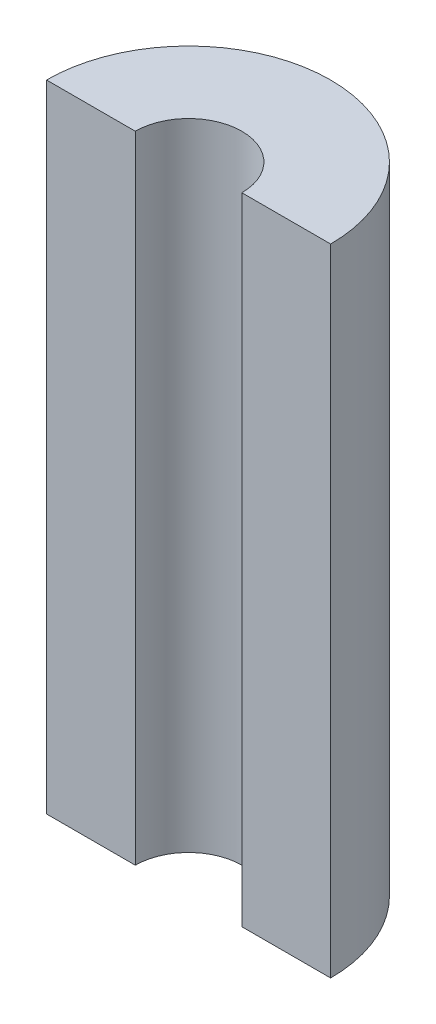
ISO-10303-21;
HEADER;
FILE_DESCRIPTION(('STEP AP214'),'2;1');
FILE_NAME('part.step','',(''),(''),'','','');
FILE_SCHEMA(('AUTOMOTIVE_DESIGN { 1 0 10303 214 1 1 1 1 }'));
ENDSEC;
DATA;
#1=APPLICATION_CONTEXT('core data for automotive mechanical design processes');
#2=APPLICATION_PROTOCOL_DEFINITION('international standard','automotive_design',2000,#1);
#3=PRODUCT_CONTEXT('',#1,'mechanical');
#4=PRODUCT('Part','Part','',(#3));
#5=PRODUCT_RELATED_PRODUCT_CATEGORY('part','',(#4));
#6=PRODUCT_DEFINITION_FORMATION('','',#4);
#7=PRODUCT_DEFINITION_CONTEXT('part definition',#1,'design');
#8=PRODUCT_DEFINITION('design','',#6,#7);
#9=PRODUCT_DEFINITION_SHAPE('','',#8);
#10=(LENGTH_UNIT() NAMED_UNIT(*) SI_UNIT(.MILLI.,.METRE.));
#11=(NAMED_UNIT(*) PLANE_ANGLE_UNIT() SI_UNIT($,.RADIAN.));
#12=(NAMED_UNIT(*) SI_UNIT($,.STERADIAN.) SOLID_ANGLE_UNIT());
#13=UNCERTAINTY_MEASURE_WITH_UNIT(LENGTH_MEASURE(1.E-05),#10,'distance_accuracy_value','');
#14=(GEOMETRIC_REPRESENTATION_CONTEXT(3) GLOBAL_UNCERTAINTY_ASSIGNED_CONTEXT((#13)) GLOBAL_UNIT_ASSIGNED_CONTEXT((#10,
#11,#12)) REPRESENTATION_CONTEXT('',''));
#15=CARTESIAN_POINT('',(0.,0.,0.));
#16=DIRECTION('',(0.,0.,1.));
#17=DIRECTION('',(1.,0.,0.));
#18=AXIS2_PLACEMENT_3D('',#15,#16,#17);
#19=CARTESIAN_POINT('',(0.,0.,0.));
#20=DIRECTION('',(0.,0.,1.));
#21=DIRECTION('',(1.,0.,0.));
#22=AXIS2_PLACEMENT_3D('',#19,#20,#21);
#23=PLANE('',#22);
#24=DIRECTION('',(1.,0.,0.));
#25=VECTOR('',#24,1.);
#26=CARTESIAN_POINT('',(0.,358.,0.));
#27=LINE('',#26,#25);
#28=CARTESIAN_POINT('',(-80.,358.,0.));
#29=VERTEX_POINT('',#28);
#30=CARTESIAN_POINT('',(-30.,358.,0.));
#31=VERTEX_POINT('',#30);
#32=EDGE_CURVE('E91',#29,#31,#27,.T.);
#33=ORIENTED_EDGE('',*,*,#32,.F.);
#34=DIRECTION('',(0.,-1.,0.));
#35=VECTOR('',#34,1.);
#36=CARTESIAN_POINT('',(-80.,358.,0.));
#37=LINE('',#36,#35);
#38=CARTESIAN_POINT('',(-80.,0.,0.));
#39=VERTEX_POINT('',#38);
#40=EDGE_CURVE('E83',#29,#39,#37,.T.);
#41=ORIENTED_EDGE('',*,*,#40,.T.);
#42=DIRECTION('',(1.,0.,0.));
#43=VECTOR('',#42,1.);
#44=CARTESIAN_POINT('',(0.,0.,0.));
#45=LINE('',#44,#43);
#46=CARTESIAN_POINT('',(-30.,0.,0.));
#47=VERTEX_POINT('',#46);
#48=EDGE_CURVE('E103',#39,#47,#45,.T.);
#49=ORIENTED_EDGE('',*,*,#48,.T.);
#50=DIRECTION('',(0.,-1.,0.));
#51=VECTOR('',#50,1.);
#52=CARTESIAN_POINT('',(-30.,358.,0.));
#53=LINE('',#52,#51);
#54=EDGE_CURVE('E57',#31,#47,#53,.T.);
#55=ORIENTED_EDGE('',*,*,#54,.F.);
#56=EDGE_LOOP('',(#33,#41,#49,#55));
#57=FACE_BOUND('',#56,.T.);
#58=ADVANCED_FACE('F34',(#57),#23,.T.);
#59=CARTESIAN_POINT('',(30.,0.,0.));
#60=VERTEX_POINT('',#59);
#61=CARTESIAN_POINT('',(80.,0.,0.));
#62=VERTEX_POINT('',#61);
#63=EDGE_CURVE('E96',#60,#62,#45,.T.);
#64=ORIENTED_EDGE('',*,*,#63,.T.);
#65=DIRECTION('',(0.,-1.,0.));
#66=VECTOR('',#65,1.);
#67=CARTESIAN_POINT('',(80.,358.,0.));
#68=LINE('',#67,#66);
#69=CARTESIAN_POINT('',(80.,358.,0.));
#70=VERTEX_POINT('',#69);
#71=EDGE_CURVE('E81',#62,#70,#68,.F.);
#72=ORIENTED_EDGE('',*,*,#71,.T.);
#73=CARTESIAN_POINT('',(30.,358.,0.));
#74=VERTEX_POINT('',#73);
#75=EDGE_CURVE('E88',#74,#70,#27,.T.);
#76=ORIENTED_EDGE('',*,*,#75,.F.);
#77=DIRECTION('',(0.,-1.,0.));
#78=VECTOR('',#77,1.);
#79=CARTESIAN_POINT('',(30.,358.,0.));
#80=LINE('',#79,#78);
#81=EDGE_CURVE('E49',#60,#74,#80,.F.);
#82=ORIENTED_EDGE('',*,*,#81,.F.);
#83=EDGE_LOOP('',(#64,#72,#76,#82));
#84=FACE_BOUND('',#83,.T.);
#85=ADVANCED_FACE('F94',(#84),#23,.T.);
#86=CARTESIAN_POINT('',(0.,0.,0.));
#87=DIRECTION('',(0.,1.,0.));
#88=DIRECTION('',(0.,0.,1.));
#89=AXIS2_PLACEMENT_3D('',#86,#87,#88);
#90=PLANE('',#89);
#91=ORIENTED_EDGE('',*,*,#48,.F.);
#92=CARTESIAN_POINT('',(0.,0.,0.));
#93=DIRECTION('',(0.,1.,0.));
#94=DIRECTION('',(0.,0.,1.));
#95=AXIS2_PLACEMENT_3D('',#92,#93,#94);
#96=CIRCLE('',#95,80.);
#97=EDGE_CURVE('E85',#62,#39,#96,.T.);
#98=ORIENTED_EDGE('',*,*,#97,.F.);
#99=ORIENTED_EDGE('',*,*,#63,.F.);
#100=CARTESIAN_POINT('',(0.,0.,0.));
#101=DIRECTION('',(0.,1.,0.));
#102=DIRECTION('',(0.,0.,1.));
#103=AXIS2_PLACEMENT_3D('',#100,#101,#102);
#104=CIRCLE('',#103,30.);
#105=EDGE_CURVE('E12',#60,#47,#104,.T.);
#106=ORIENTED_EDGE('',*,*,#105,.T.);
#107=EDGE_LOOP('',(#91,#98,#99,#106));
#108=FACE_BOUND('',#107,.T.);
#109=ADVANCED_FACE('F105',(#108),#90,.F.);
#110=CARTESIAN_POINT('',(0.,358.,0.));
#111=DIRECTION('',(0.,1.,0.));
#112=DIRECTION('',(0.,0.,1.));
#113=AXIS2_PLACEMENT_3D('',#110,#111,#112);
#114=PLANE('',#113);
#115=CARTESIAN_POINT('',(0.,358.,0.));
#116=DIRECTION('',(0.,1.,0.));
#117=DIRECTION('',(0.,0.,1.));
#118=AXIS2_PLACEMENT_3D('',#115,#116,#117);
#119=CIRCLE('',#118,80.);
#120=EDGE_CURVE('E77',#70,#29,#119,.T.);
#121=ORIENTED_EDGE('',*,*,#120,.T.);
#122=ORIENTED_EDGE('',*,*,#32,.T.);
#123=CARTESIAN_POINT('',(0.,358.,0.));
#124=DIRECTION('',(0.,1.,0.));
#125=DIRECTION('',(0.,0.,1.));
#126=AXIS2_PLACEMENT_3D('',#123,#124,#125);
#127=CIRCLE('',#126,30.);
#128=EDGE_CURVE('E42',#74,#31,#127,.T.);
#129=ORIENTED_EDGE('',*,*,#128,.F.);
#130=ORIENTED_EDGE('',*,*,#75,.T.);
#131=EDGE_LOOP('',(#121,#122,#129,#130));
#132=FACE_BOUND('',#131,.T.);
#133=ADVANCED_FACE('F89',(#132),#114,.T.);
#134=CARTESIAN_POINT('',(0.,358.,0.));
#135=DIRECTION('',(0.,-1.,0.));
#136=DIRECTION('',(0.,0.,-1.));
#137=AXIS2_PLACEMENT_3D('',#134,#135,#136);
#138=CYLINDRICAL_SURFACE('',#137,30.);
#139=ORIENTED_EDGE('',*,*,#128,.T.);
#140=ORIENTED_EDGE('',*,*,#54,.T.);
#141=ORIENTED_EDGE('',*,*,#105,.F.);
#142=ORIENTED_EDGE('',*,*,#81,.T.);
#143=EDGE_LOOP('',(#139,#140,#141,#142));
#144=FACE_BOUND('',#143,.T.);
#145=ADVANCED_FACE('F36',(#144),#138,.F.);
#146=CARTESIAN_POINT('',(0.,358.,0.));
#147=DIRECTION('',(0.,-1.,0.));
#148=DIRECTION('',(0.,0.,-1.));
#149=AXIS2_PLACEMENT_3D('',#146,#147,#148);
#150=CYLINDRICAL_SURFACE('',#149,80.);
#151=ORIENTED_EDGE('',*,*,#40,.F.);
#152=ORIENTED_EDGE('',*,*,#120,.F.);
#153=ORIENTED_EDGE('',*,*,#71,.F.);
#154=ORIENTED_EDGE('',*,*,#97,.T.);
#155=EDGE_LOOP('',(#151,#152,#153,#154));
#156=FACE_BOUND('',#155,.T.);
#157=ADVANCED_FACE('F79',(#156),#150,.T.);
#158=CLOSED_SHELL('',(#58,#85,#109,#133,#145,#157));
#159=MANIFOLD_SOLID_BREP('B2',#158);
#160=ADVANCED_BREP_SHAPE_REPRESENTATION('',(#18,#159),#14);
#161=SHAPE_DEFINITION_REPRESENTATION(#9,#160);
ENDSEC;
END-ISO-10303-21;
